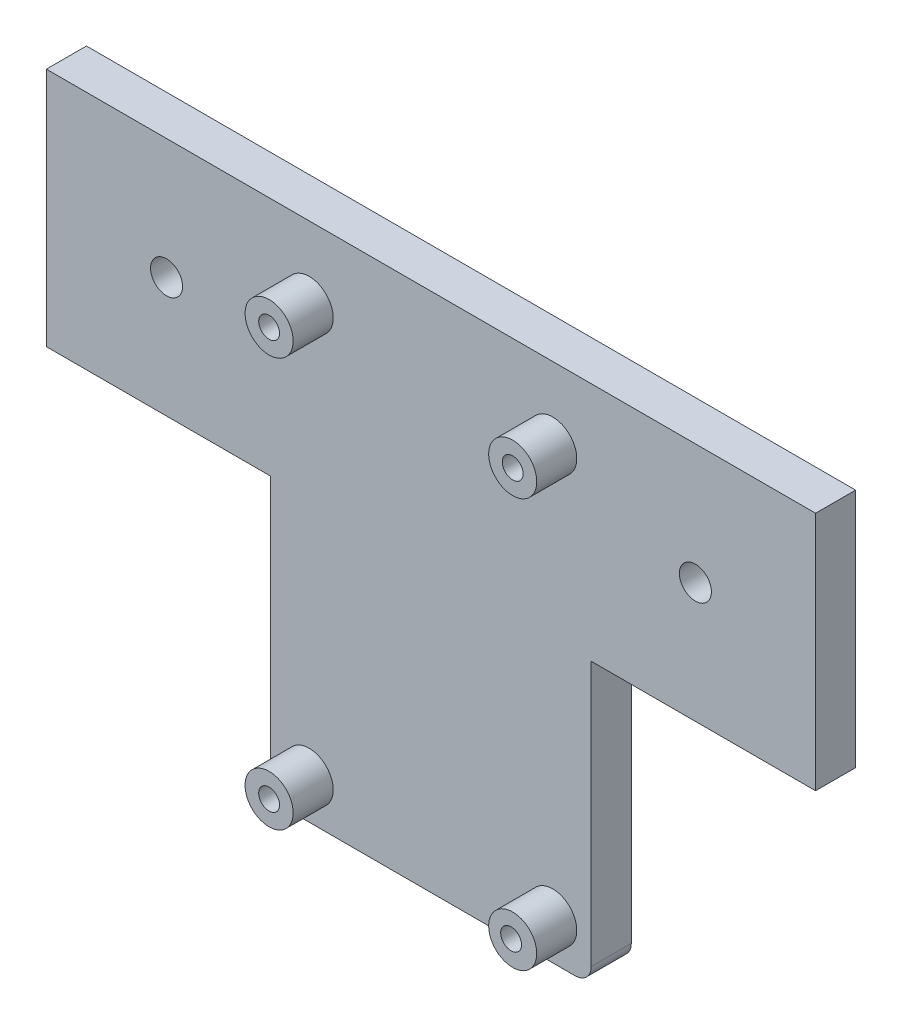
ISO-10303-21;
HEADER;
FILE_DESCRIPTION(('STEP AP214'),'2;1');
FILE_NAME('part.step','',(''),(''),'','','');
FILE_SCHEMA(('AUTOMOTIVE_DESIGN { 1 0 10303 214 1 1 1 1 }'));
ENDSEC;
DATA;
#1=APPLICATION_CONTEXT('core data for automotive mechanical design processes');
#2=APPLICATION_PROTOCOL_DEFINITION('international standard','automotive_design',2000,#1);
#3=PRODUCT_CONTEXT('',#1,'mechanical');
#4=PRODUCT('Part','Part','',(#3));
#5=PRODUCT_RELATED_PRODUCT_CATEGORY('part','',(#4));
#6=PRODUCT_DEFINITION_FORMATION('','',#4);
#7=PRODUCT_DEFINITION_CONTEXT('part definition',#1,'design');
#8=PRODUCT_DEFINITION('design','',#6,#7);
#9=PRODUCT_DEFINITION_SHAPE('','',#8);
#10=(LENGTH_UNIT() NAMED_UNIT(*) SI_UNIT(.MILLI.,.METRE.));
#11=(NAMED_UNIT(*) PLANE_ANGLE_UNIT() SI_UNIT($,.RADIAN.));
#12=(NAMED_UNIT(*) SI_UNIT($,.STERADIAN.) SOLID_ANGLE_UNIT());
#13=UNCERTAINTY_MEASURE_WITH_UNIT(LENGTH_MEASURE(1.E-05),#10,'distance_accuracy_value','');
#14=(GEOMETRIC_REPRESENTATION_CONTEXT(3) GLOBAL_UNCERTAINTY_ASSIGNED_CONTEXT((#13)) GLOBAL_UNIT_ASSIGNED_CONTEXT((#10,
#11,#12)) REPRESENTATION_CONTEXT('',''));
#15=CARTESIAN_POINT('',(0.,0.,0.));
#16=DIRECTION('',(0.,0.,1.));
#17=DIRECTION('',(1.,0.,0.));
#18=AXIS2_PLACEMENT_3D('',#15,#16,#17);
#19=CARTESIAN_POINT('',(0.,0.,5.));
#20=DIRECTION('',(0.,1.,0.));
#21=DIRECTION('',(0.,0.,1.));
#22=AXIS2_PLACEMENT_3D('',#19,#20,#21);
#23=PLANE('',#22);
#24=DIRECTION('',(0.,0.,1.));
#25=VECTOR('',#24,1.);
#26=CARTESIAN_POINT('',(68.,0.,0.));
#27=LINE('',#26,#25);
#28=CARTESIAN_POINT('',(68.,0.,0.));
#29=VERTEX_POINT('',#28);
#30=CARTESIAN_POINT('',(68.,0.,5.));
#31=VERTEX_POINT('',#30);
#32=EDGE_CURVE('E118',#29,#31,#27,.T.);
#33=ORIENTED_EDGE('',*,*,#32,.F.);
#34=DIRECTION('',(1.,0.,0.));
#35=VECTOR('',#34,1.);
#36=CARTESIAN_POINT('',(0.,0.,0.));
#37=LINE('',#36,#35);
#38=CARTESIAN_POINT('',(96.,0.,0.));
#39=VERTEX_POINT('',#38);
#40=EDGE_CURVE('E126',#29,#39,#37,.T.);
#41=ORIENTED_EDGE('',*,*,#40,.T.);
#42=DIRECTION('',(0.,0.,-1.));
#43=VECTOR('',#42,1.);
#44=CARTESIAN_POINT('',(96.,0.,5.));
#45=LINE('',#44,#43);
#46=CARTESIAN_POINT('',(96.,0.,5.));
#47=VERTEX_POINT('',#46);
#48=EDGE_CURVE('E162',#47,#39,#45,.T.);
#49=ORIENTED_EDGE('',*,*,#48,.F.);
#50=DIRECTION('',(1.,0.,0.));
#51=VECTOR('',#50,1.);
#52=CARTESIAN_POINT('',(0.,0.,5.));
#53=LINE('',#52,#51);
#54=EDGE_CURVE('E128',#31,#47,#53,.T.);
#55=ORIENTED_EDGE('',*,*,#54,.F.);
#56=EDGE_LOOP('',(#33,#41,#49,#55));
#57=FACE_BOUND('',#56,.T.);
#58=ADVANCED_FACE('F39',(#57),#23,.F.);
#59=CARTESIAN_POINT('',(0.,0.,5.));
#60=DIRECTION('',(1.,0.,0.));
#61=DIRECTION('',(0.,0.,-1.));
#62=AXIS2_PLACEMENT_3D('',#59,#60,#61);
#63=PLANE('',#62);
#64=DIRECTION('',(0.,-1.,0.));
#65=VECTOR('',#64,1.);
#66=CARTESIAN_POINT('',(0.,0.,0.));
#67=LINE('',#66,#65);
#68=CARTESIAN_POINT('',(0.,30.,0.));
#69=VERTEX_POINT('',#68);
#70=CARTESIAN_POINT('',(0.,0.,0.));
#71=VERTEX_POINT('',#70);
#72=EDGE_CURVE('E138',#69,#71,#67,.T.);
#73=ORIENTED_EDGE('',*,*,#72,.T.);
#74=DIRECTION('',(0.,0.,-1.));
#75=VECTOR('',#74,1.);
#76=CARTESIAN_POINT('',(0.,0.,5.));
#77=LINE('',#76,#75);
#78=CARTESIAN_POINT('',(0.,0.,5.));
#79=VERTEX_POINT('',#78);
#80=EDGE_CURVE('E165',#79,#71,#77,.T.);
#81=ORIENTED_EDGE('',*,*,#80,.F.);
#82=DIRECTION('',(0.,-1.,0.));
#83=VECTOR('',#82,1.);
#84=CARTESIAN_POINT('',(0.,0.,5.));
#85=LINE('',#84,#83);
#86=CARTESIAN_POINT('',(0.,30.,5.));
#87=VERTEX_POINT('',#86);
#88=EDGE_CURVE('E152',#87,#79,#85,.T.);
#89=ORIENTED_EDGE('',*,*,#88,.F.);
#90=DIRECTION('',(0.,0.,-1.));
#91=VECTOR('',#90,1.);
#92=CARTESIAN_POINT('',(0.,30.,5.));
#93=LINE('',#92,#91);
#94=EDGE_CURVE('E153',#87,#69,#93,.T.);
#95=ORIENTED_EDGE('',*,*,#94,.T.);
#96=EDGE_LOOP('',(#73,#81,#89,#95));
#97=FACE_BOUND('',#96,.T.);
#98=ADVANCED_FACE('F258',(#97),#63,.F.);
#99=CARTESIAN_POINT('',(28.,0.,0.));
#100=VERTEX_POINT('',#99);
#101=EDGE_CURVE('E137',#71,#100,#37,.T.);
#102=ORIENTED_EDGE('',*,*,#101,.T.);
#103=DIRECTION('',(0.,0.,1.));
#104=VECTOR('',#103,1.);
#105=CARTESIAN_POINT('',(28.,0.,0.));
#106=LINE('',#105,#104);
#107=CARTESIAN_POINT('',(28.,0.,5.));
#108=VERTEX_POINT('',#107);
#109=EDGE_CURVE('E130',#100,#108,#106,.T.);
#110=ORIENTED_EDGE('',*,*,#109,.T.);
#111=EDGE_CURVE('E242',#79,#108,#53,.T.);
#112=ORIENTED_EDGE('',*,*,#111,.F.);
#113=ORIENTED_EDGE('',*,*,#80,.T.);
#114=EDGE_LOOP('',(#102,#110,#112,#113));
#115=FACE_BOUND('',#114,.T.);
#116=ADVANCED_FACE('F260',(#115),#23,.F.);
#117=CARTESIAN_POINT('',(96.,0.,5.));
#118=DIRECTION('',(-1.,0.,0.));
#119=DIRECTION('',(0.,0.,1.));
#120=AXIS2_PLACEMENT_3D('',#117,#118,#119);
#121=PLANE('',#120);
#122=DIRECTION('',(0.,1.,0.));
#123=VECTOR('',#122,1.);
#124=CARTESIAN_POINT('',(96.,0.,0.));
#125=LINE('',#124,#123);
#126=CARTESIAN_POINT('',(96.,30.,0.));
#127=VERTEX_POINT('',#126);
#128=EDGE_CURVE('E135',#39,#127,#125,.T.);
#129=ORIENTED_EDGE('',*,*,#128,.T.);
#130=DIRECTION('',(0.,0.,-1.));
#131=VECTOR('',#130,1.);
#132=CARTESIAN_POINT('',(96.,30.,5.));
#133=LINE('',#132,#131);
#134=CARTESIAN_POINT('',(96.,30.,5.));
#135=VERTEX_POINT('',#134);
#136=EDGE_CURVE('E157',#135,#127,#133,.T.);
#137=ORIENTED_EDGE('',*,*,#136,.F.);
#138=DIRECTION('',(0.,1.,0.));
#139=VECTOR('',#138,1.);
#140=CARTESIAN_POINT('',(96.,0.,5.));
#141=LINE('',#140,#139);
#142=EDGE_CURVE('E245',#47,#135,#141,.T.);
#143=ORIENTED_EDGE('',*,*,#142,.F.);
#144=ORIENTED_EDGE('',*,*,#48,.T.);
#145=EDGE_LOOP('',(#129,#137,#143,#144));
#146=FACE_BOUND('',#145,.T.);
#147=ADVANCED_FACE('F262',(#146),#121,.F.);
#148=CARTESIAN_POINT('',(0.,30.,5.));
#149=DIRECTION('',(0.,-1.,0.));
#150=DIRECTION('',(0.,0.,-1.));
#151=AXIS2_PLACEMENT_3D('',#148,#149,#150);
#152=PLANE('',#151);
#153=DIRECTION('',(-1.,0.,0.));
#154=VECTOR('',#153,1.);
#155=CARTESIAN_POINT('',(0.,30.,0.));
#156=LINE('',#155,#154);
#157=EDGE_CURVE('E149',#127,#69,#156,.T.);
#158=ORIENTED_EDGE('',*,*,#157,.T.);
#159=ORIENTED_EDGE('',*,*,#94,.F.);
#160=DIRECTION('',(-1.,0.,0.));
#161=VECTOR('',#160,1.);
#162=CARTESIAN_POINT('',(0.,30.,5.));
#163=LINE('',#162,#161);
#164=EDGE_CURVE('E158',#135,#87,#163,.T.);
#165=ORIENTED_EDGE('',*,*,#164,.F.);
#166=ORIENTED_EDGE('',*,*,#136,.T.);
#167=EDGE_LOOP('',(#158,#159,#165,#166));
#168=FACE_BOUND('',#167,.T.);
#169=ADVANCED_FACE('F255',(#168),#152,.F.);
#170=CARTESIAN_POINT('',(0.,0.,5.));
#171=DIRECTION('',(0.,0.,-1.));
#172=DIRECTION('',(-1.,0.,0.));
#173=AXIS2_PLACEMENT_3D('',#170,#171,#172);
#174=PLANE('',#173);
#175=CARTESIAN_POINT('',(32.8,21.,5.));
#176=DIRECTION('',(0.,0.,-1.));
#177=DIRECTION('',(-1.,0.,0.));
#178=AXIS2_PLACEMENT_3D('',#175,#176,#177);
#179=CIRCLE('',#178,3.);
#180=CARTESIAN_POINT('',(29.8,21.,5.));
#181=VERTEX_POINT('',#180);
#182=EDGE_CURVE('E181',#181,#181,#179,.F.);
#183=ORIENTED_EDGE('',*,*,#182,.F.);
#184=EDGE_LOOP('',(#183));
#185=FACE_BOUND('',#184,.T.);
#186=CARTESIAN_POINT('',(63.2,21.,5.));
#187=DIRECTION('',(0.,0.,-1.));
#188=DIRECTION('',(-1.,0.,0.));
#189=AXIS2_PLACEMENT_3D('',#186,#187,#188);
#190=CIRCLE('',#189,3.00000000000001);
#191=CARTESIAN_POINT('',(60.2,21.,5.));
#192=VERTEX_POINT('',#191);
#193=EDGE_CURVE('E177',#192,#192,#190,.F.);
#194=ORIENTED_EDGE('',*,*,#193,.F.);
#195=EDGE_LOOP('',(#194));
#196=FACE_BOUND('',#195,.T.);
#197=CARTESIAN_POINT('',(63.2,-30.,5.));
#198=DIRECTION('',(0.,0.,-1.));
#199=DIRECTION('',(-1.,0.,0.));
#200=AXIS2_PLACEMENT_3D('',#197,#198,#199);
#201=CIRCLE('',#200,3.00000000000001);
#202=CARTESIAN_POINT('',(60.2,-30.,5.));
#203=VERTEX_POINT('',#202);
#204=EDGE_CURVE('E173',#203,#203,#201,.F.);
#205=ORIENTED_EDGE('',*,*,#204,.F.);
#206=EDGE_LOOP('',(#205));
#207=FACE_BOUND('',#206,.T.);
#208=CARTESIAN_POINT('',(32.8,-30.,5.));
#209=DIRECTION('',(0.,0.,-1.));
#210=DIRECTION('',(-1.,0.,0.));
#211=AXIS2_PLACEMENT_3D('',#208,#209,#210);
#212=CIRCLE('',#211,3.);
#213=CARTESIAN_POINT('',(29.8,-30.,5.));
#214=VERTEX_POINT('',#213);
#215=EDGE_CURVE('E169',#214,#214,#212,.F.);
#216=ORIENTED_EDGE('',*,*,#215,.F.);
#217=EDGE_LOOP('',(#216));
#218=FACE_BOUND('',#217,.T.);
#219=CARTESIAN_POINT('',(15.,15.,5.));
#220=DIRECTION('',(0.,0.,1.));
#221=DIRECTION('',(1.,0.,0.));
#222=AXIS2_PLACEMENT_3D('',#219,#220,#221);
#223=CIRCLE('',#222,2.);
#224=CARTESIAN_POINT('',(17.,15.,5.));
#225=VERTEX_POINT('',#224);
#226=EDGE_CURVE('E582',#225,#225,#223,.T.);
#227=ORIENTED_EDGE('',*,*,#226,.F.);
#228=EDGE_LOOP('',(#227));
#229=FACE_BOUND('',#228,.T.);
#230=CARTESIAN_POINT('',(81.,15.,5.));
#231=DIRECTION('',(0.,0.,1.));
#232=DIRECTION('',(1.,0.,0.));
#233=AXIS2_PLACEMENT_3D('',#230,#231,#232);
#234=CIRCLE('',#233,2.);
#235=CARTESIAN_POINT('',(83.,15.,5.));
#236=VERTEX_POINT('',#235);
#237=EDGE_CURVE('E578',#236,#236,#234,.T.);
#238=ORIENTED_EDGE('',*,*,#237,.F.);
#239=EDGE_LOOP('',(#238));
#240=FACE_BOUND('',#239,.T.);
#241=DIRECTION('',(0.,-1.,0.));
#242=VECTOR('',#241,1.);
#243=CARTESIAN_POINT('',(28.,0.,5.));
#244=LINE('',#243,#242);
#245=CARTESIAN_POINT('',(28.,-33.,5.));
#246=VERTEX_POINT('',#245);
#247=EDGE_CURVE('E225',#108,#246,#244,.T.);
#248=ORIENTED_EDGE('',*,*,#247,.T.);
#249=CARTESIAN_POINT('',(30.,-33.,5.));
#250=DIRECTION('',(0.,0.,-1.));
#251=DIRECTION('',(-1.,0.,0.));
#252=AXIS2_PLACEMENT_3D('',#249,#250,#251);
#253=CIRCLE('',#252,2.);
#254=CARTESIAN_POINT('',(30.,-35.,5.));
#255=VERTEX_POINT('',#254);
#256=EDGE_CURVE('E192',#246,#255,#253,.F.);
#257=ORIENTED_EDGE('',*,*,#256,.T.);
#258=DIRECTION('',(1.,0.,0.));
#259=VECTOR('',#258,1.);
#260=CARTESIAN_POINT('',(28.,-35.,5.));
#261=LINE('',#260,#259);
#262=CARTESIAN_POINT('',(66.,-35.,5.));
#263=VERTEX_POINT('',#262);
#264=EDGE_CURVE('E223',#255,#263,#261,.T.);
#265=ORIENTED_EDGE('',*,*,#264,.T.);
#266=CARTESIAN_POINT('',(66.,-33.,5.));
#267=DIRECTION('',(0.,0.,-1.));
#268=DIRECTION('',(-1.,0.,0.));
#269=AXIS2_PLACEMENT_3D('',#266,#267,#268);
#270=CIRCLE('',#269,2.);
#271=CARTESIAN_POINT('',(68.,-33.,5.));
#272=VERTEX_POINT('',#271);
#273=EDGE_CURVE('E189',#263,#272,#270,.F.);
#274=ORIENTED_EDGE('',*,*,#273,.T.);
#275=DIRECTION('',(0.,1.,0.));
#276=VECTOR('',#275,1.);
#277=CARTESIAN_POINT('',(68.,0.,5.));
#278=LINE('',#277,#276);
#279=EDGE_CURVE('E216',#272,#31,#278,.T.);
#280=ORIENTED_EDGE('',*,*,#279,.T.);
#281=ORIENTED_EDGE('',*,*,#54,.T.);
#282=ORIENTED_EDGE('',*,*,#142,.T.);
#283=ORIENTED_EDGE('',*,*,#164,.T.);
#284=ORIENTED_EDGE('',*,*,#88,.T.);
#285=ORIENTED_EDGE('',*,*,#111,.T.);
#286=EDGE_LOOP('',(#248,#257,#265,#274,#280,#281,#282,#283,#284,#285));
#287=FACE_BOUND('',#286,.T.);
#288=ADVANCED_FACE('F222',(#185,#196,#207,#218,#229,#240,#287),#174,.F.);
#289=CARTESIAN_POINT('',(0.,0.,0.));
#290=DIRECTION('',(0.,0.,-1.));
#291=DIRECTION('',(-1.,0.,0.));
#292=AXIS2_PLACEMENT_3D('',#289,#290,#291);
#293=PLANE('',#292);
#294=CARTESIAN_POINT('',(15.,15.,0.));
#295=DIRECTION('',(0.,0.,1.));
#296=DIRECTION('',(1.,0.,0.));
#297=AXIS2_PLACEMENT_3D('',#294,#295,#296);
#298=CIRCLE('',#297,2.);
#299=CARTESIAN_POINT('',(17.,15.,0.));
#300=VERTEX_POINT('',#299);
#301=EDGE_CURVE('E234',#300,#300,#298,.T.);
#302=ORIENTED_EDGE('',*,*,#301,.T.);
#303=EDGE_LOOP('',(#302));
#304=FACE_BOUND('',#303,.T.);
#305=CARTESIAN_POINT('',(81.,15.,0.));
#306=DIRECTION('',(0.,0.,1.));
#307=DIRECTION('',(1.,0.,0.));
#308=AXIS2_PLACEMENT_3D('',#305,#306,#307);
#309=CIRCLE('',#308,2.);
#310=CARTESIAN_POINT('',(83.,15.,0.));
#311=VERTEX_POINT('',#310);
#312=EDGE_CURVE('E586',#311,#311,#309,.T.);
#313=ORIENTED_EDGE('',*,*,#312,.T.);
#314=EDGE_LOOP('',(#313));
#315=FACE_BOUND('',#314,.T.);
#316=DIRECTION('',(1.,0.,0.));
#317=VECTOR('',#316,1.);
#318=CARTESIAN_POINT('',(28.,-35.,0.));
#319=LINE('',#318,#317);
#320=CARTESIAN_POINT('',(30.,-35.,0.));
#321=VERTEX_POINT('',#320);
#322=CARTESIAN_POINT('',(66.,-35.,0.));
#323=VERTEX_POINT('',#322);
#324=EDGE_CURVE('E122',#321,#323,#319,.T.);
#325=ORIENTED_EDGE('',*,*,#324,.F.);
#326=CARTESIAN_POINT('',(30.,-33.,0.));
#327=DIRECTION('',(0.,0.,-1.));
#328=DIRECTION('',(-1.,0.,0.));
#329=AXIS2_PLACEMENT_3D('',#326,#327,#328);
#330=CIRCLE('',#329,2.);
#331=CARTESIAN_POINT('',(28.,-33.,0.));
#332=VERTEX_POINT('',#331);
#333=EDGE_CURVE('E48',#321,#332,#330,.T.);
#334=ORIENTED_EDGE('',*,*,#333,.T.);
#335=DIRECTION('',(0.,-1.,0.));
#336=VECTOR('',#335,1.);
#337=CARTESIAN_POINT('',(28.,0.,0.));
#338=LINE('',#337,#336);
#339=EDGE_CURVE('E207',#100,#332,#338,.T.);
#340=ORIENTED_EDGE('',*,*,#339,.F.);
#341=ORIENTED_EDGE('',*,*,#101,.F.);
#342=ORIENTED_EDGE('',*,*,#72,.F.);
#343=ORIENTED_EDGE('',*,*,#157,.F.);
#344=ORIENTED_EDGE('',*,*,#128,.F.);
#345=ORIENTED_EDGE('',*,*,#40,.F.);
#346=DIRECTION('',(0.,1.,0.));
#347=VECTOR('',#346,1.);
#348=CARTESIAN_POINT('',(68.,0.,0.));
#349=LINE('',#348,#347);
#350=CARTESIAN_POINT('',(68.,-33.,0.));
#351=VERTEX_POINT('',#350);
#352=EDGE_CURVE('E115',#351,#29,#349,.T.);
#353=ORIENTED_EDGE('',*,*,#352,.F.);
#354=CARTESIAN_POINT('',(66.,-33.,0.));
#355=DIRECTION('',(0.,0.,-1.));
#356=DIRECTION('',(-1.,0.,0.));
#357=AXIS2_PLACEMENT_3D('',#354,#355,#356);
#358=CIRCLE('',#357,2.);
#359=EDGE_CURVE('E60',#351,#323,#358,.T.);
#360=ORIENTED_EDGE('',*,*,#359,.T.);
#361=EDGE_LOOP('',(#325,#334,#340,#341,#342,#343,#344,#345,#353,#360));
#362=FACE_BOUND('',#361,.T.);
#363=ADVANCED_FACE('F133',(#304,#315,#362),#293,.T.);
#364=CARTESIAN_POINT('',(28.,0.,0.));
#365=DIRECTION('',(-1.,0.,0.));
#366=DIRECTION('',(0.,-1.,0.));
#367=AXIS2_PLACEMENT_3D('',#364,#365,#366);
#368=PLANE('',#367);
#369=ORIENTED_EDGE('',*,*,#339,.T.);
#370=DIRECTION('',(0.,0.,1.));
#371=VECTOR('',#370,1.);
#372=CARTESIAN_POINT('',(28.,-33.,0.));
#373=LINE('',#372,#371);
#374=EDGE_CURVE('E185',#332,#246,#373,.T.);
#375=ORIENTED_EDGE('',*,*,#374,.T.);
#376=ORIENTED_EDGE('',*,*,#247,.F.);
#377=ORIENTED_EDGE('',*,*,#109,.F.);
#378=EDGE_LOOP('',(#369,#375,#376,#377));
#379=FACE_BOUND('',#378,.T.);
#380=ADVANCED_FACE('F212',(#379),#368,.T.);
#381=CARTESIAN_POINT('',(68.,0.,0.));
#382=DIRECTION('',(1.,0.,0.));
#383=DIRECTION('',(0.,0.,-1.));
#384=AXIS2_PLACEMENT_3D('',#381,#382,#383);
#385=PLANE('',#384);
#386=ORIENTED_EDGE('',*,*,#279,.F.);
#387=DIRECTION('',(0.,0.,1.));
#388=VECTOR('',#387,1.);
#389=CARTESIAN_POINT('',(68.,-33.,0.));
#390=LINE('',#389,#388);
#391=EDGE_CURVE('E11',#272,#351,#390,.F.);
#392=ORIENTED_EDGE('',*,*,#391,.T.);
#393=ORIENTED_EDGE('',*,*,#352,.T.);
#394=ORIENTED_EDGE('',*,*,#32,.T.);
#395=EDGE_LOOP('',(#386,#392,#393,#394));
#396=FACE_BOUND('',#395,.T.);
#397=ADVANCED_FACE('F117',(#396),#385,.T.);
#398=CARTESIAN_POINT('',(28.,-35.,0.));
#399=DIRECTION('',(0.,-1.,0.));
#400=DIRECTION('',(0.,0.,-1.));
#401=AXIS2_PLACEMENT_3D('',#398,#399,#400);
#402=PLANE('',#401);
#403=ORIENTED_EDGE('',*,*,#264,.F.);
#404=DIRECTION('',(0.,0.,1.));
#405=VECTOR('',#404,1.);
#406=CARTESIAN_POINT('',(30.,-35.,0.));
#407=LINE('',#406,#405);
#408=EDGE_CURVE('E199',#255,#321,#407,.F.);
#409=ORIENTED_EDGE('',*,*,#408,.T.);
#410=ORIENTED_EDGE('',*,*,#324,.T.);
#411=DIRECTION('',(0.,0.,1.));
#412=VECTOR('',#411,1.);
#413=CARTESIAN_POINT('',(66.,-35.,0.));
#414=LINE('',#413,#412);
#415=EDGE_CURVE('E195',#323,#263,#414,.T.);
#416=ORIENTED_EDGE('',*,*,#415,.T.);
#417=EDGE_LOOP('',(#403,#409,#410,#416));
#418=FACE_BOUND('',#417,.T.);
#419=ADVANCED_FACE('F227',(#418),#402,.T.);
#420=CARTESIAN_POINT('',(81.,15.,0.));
#421=DIRECTION('',(0.,0.,1.));
#422=DIRECTION('',(1.,0.,0.));
#423=AXIS2_PLACEMENT_3D('',#420,#421,#422);
#424=CYLINDRICAL_SURFACE('',#423,2.);
#425=ORIENTED_EDGE('',*,*,#312,.F.);
#426=EDGE_LOOP('',(#425));
#427=FACE_BOUND('',#426,.T.);
#428=ORIENTED_EDGE('',*,*,#237,.T.);
#429=EDGE_LOOP('',(#428));
#430=FACE_BOUND('',#429,.T.);
#431=ADVANCED_FACE('F339',(#427,#430),#424,.F.);
#432=CARTESIAN_POINT('',(15.,15.,0.));
#433=DIRECTION('',(0.,0.,1.));
#434=DIRECTION('',(1.,0.,0.));
#435=AXIS2_PLACEMENT_3D('',#432,#433,#434);
#436=CYLINDRICAL_SURFACE('',#435,2.);
#437=ORIENTED_EDGE('',*,*,#301,.F.);
#438=EDGE_LOOP('',(#437));
#439=FACE_BOUND('',#438,.T.);
#440=ORIENTED_EDGE('',*,*,#226,.T.);
#441=EDGE_LOOP('',(#440));
#442=FACE_BOUND('',#441,.T.);
#443=ADVANCED_FACE('F349',(#439,#442),#436,.F.);
#444=CARTESIAN_POINT('',(32.8,-30.,10.));
#445=DIRECTION('',(0.,0.,-1.));
#446=DIRECTION('',(-1.,0.,0.));
#447=AXIS2_PLACEMENT_3D('',#444,#445,#446);
#448=CYLINDRICAL_SURFACE('',#447,3.);
#449=CARTESIAN_POINT('',(32.8,-30.,10.));
#450=DIRECTION('',(0.,0.,1.));
#451=DIRECTION('',(1.,0.,0.));
#452=AXIS2_PLACEMENT_3D('',#449,#450,#451);
#453=CIRCLE('',#452,3.);
#454=CARTESIAN_POINT('',(35.8,-30.,10.));
#455=VERTEX_POINT('',#454);
#456=EDGE_CURVE('E574',#455,#455,#453,.T.);
#457=ORIENTED_EDGE('',*,*,#456,.F.);
#458=EDGE_LOOP('',(#457));
#459=FACE_BOUND('',#458,.T.);
#460=ORIENTED_EDGE('',*,*,#215,.T.);
#461=EDGE_LOOP('',(#460));
#462=FACE_BOUND('',#461,.T.);
#463=ADVANCED_FACE('F356',(#459,#462),#448,.T.);
#464=CARTESIAN_POINT('',(32.8,-30.,10.));
#465=DIRECTION('',(0.,0.,1.));
#466=DIRECTION('',(1.,0.,0.));
#467=AXIS2_PLACEMENT_3D('',#464,#465,#466);
#468=PLANE('',#467);
#469=CARTESIAN_POINT('',(32.8,-30.,10.));
#470=DIRECTION('',(0.,0.,1.));
#471=DIRECTION('',(1.,0.,0.));
#472=AXIS2_PLACEMENT_3D('',#469,#470,#471);
#473=CIRCLE('',#472,1.3);
#474=CARTESIAN_POINT('',(34.1,-30.,10.));
#475=VERTEX_POINT('',#474);
#476=EDGE_CURVE('E542',#475,#475,#473,.T.);
#477=ORIENTED_EDGE('',*,*,#476,.F.);
#478=EDGE_LOOP('',(#477));
#479=FACE_BOUND('',#478,.T.);
#480=ORIENTED_EDGE('',*,*,#456,.T.);
#481=EDGE_LOOP('',(#480));
#482=FACE_BOUND('',#481,.T.);
#483=ADVANCED_FACE('F364',(#479,#482),#468,.T.);
#484=CARTESIAN_POINT('',(63.2,-30.,10.));
#485=DIRECTION('',(0.,0.,-1.));
#486=DIRECTION('',(-1.,0.,0.));
#487=AXIS2_PLACEMENT_3D('',#484,#485,#486);
#488=CYLINDRICAL_SURFACE('',#487,3.00000000000001);
#489=CARTESIAN_POINT('',(63.2,-30.,10.));
#490=DIRECTION('',(0.,0.,1.));
#491=DIRECTION('',(1.,0.,0.));
#492=AXIS2_PLACEMENT_3D('',#489,#490,#491);
#493=CIRCLE('',#492,3.00000000000001);
#494=CARTESIAN_POINT('',(66.2,-30.,10.));
#495=VERTEX_POINT('',#494);
#496=EDGE_CURVE('E570',#495,#495,#493,.T.);
#497=ORIENTED_EDGE('',*,*,#496,.F.);
#498=EDGE_LOOP('',(#497));
#499=FACE_BOUND('',#498,.T.);
#500=ORIENTED_EDGE('',*,*,#204,.T.);
#501=EDGE_LOOP('',(#500));
#502=FACE_BOUND('',#501,.T.);
#503=ADVANCED_FACE('F373',(#499,#502),#488,.T.);
#504=CARTESIAN_POINT('',(63.2,-30.,10.));
#505=DIRECTION('',(0.,0.,1.));
#506=DIRECTION('',(1.,0.,0.));
#507=AXIS2_PLACEMENT_3D('',#504,#505,#506);
#508=PLANE('',#507);
#509=CARTESIAN_POINT('',(63.,-30.,10.));
#510=DIRECTION('',(0.,0.,1.));
#511=DIRECTION('',(1.,0.,0.));
#512=AXIS2_PLACEMENT_3D('',#509,#510,#511);
#513=CIRCLE('',#512,1.29999999999999);
#514=CARTESIAN_POINT('',(64.3,-30.,10.));
#515=VERTEX_POINT('',#514);
#516=EDGE_CURVE('E601',#515,#515,#513,.T.);
#517=ORIENTED_EDGE('',*,*,#516,.F.);
#518=EDGE_LOOP('',(#517));
#519=FACE_BOUND('',#518,.T.);
#520=ORIENTED_EDGE('',*,*,#496,.T.);
#521=EDGE_LOOP('',(#520));
#522=FACE_BOUND('',#521,.T.);
#523=ADVANCED_FACE('F382',(#519,#522),#508,.T.);
#524=CARTESIAN_POINT('',(63.2,21.,10.));
#525=DIRECTION('',(0.,0.,-1.));
#526=DIRECTION('',(-1.,0.,0.));
#527=AXIS2_PLACEMENT_3D('',#524,#525,#526);
#528=CYLINDRICAL_SURFACE('',#527,3.00000000000001);
#529=CARTESIAN_POINT('',(63.2,21.,10.));
#530=DIRECTION('',(0.,0.,1.));
#531=DIRECTION('',(1.,0.,0.));
#532=AXIS2_PLACEMENT_3D('',#529,#530,#531);
#533=CIRCLE('',#532,3.00000000000001);
#534=CARTESIAN_POINT('',(66.2,21.,10.));
#535=VERTEX_POINT('',#534);
#536=EDGE_CURVE('E566',#535,#535,#533,.T.);
#537=ORIENTED_EDGE('',*,*,#536,.F.);
#538=EDGE_LOOP('',(#537));
#539=FACE_BOUND('',#538,.T.);
#540=ORIENTED_EDGE('',*,*,#193,.T.);
#541=EDGE_LOOP('',(#540));
#542=FACE_BOUND('',#541,.T.);
#543=ADVANCED_FACE('F390',(#539,#542),#528,.T.);
#544=CARTESIAN_POINT('',(63.2,21.,10.));
#545=DIRECTION('',(0.,0.,1.));
#546=DIRECTION('',(1.,0.,0.));
#547=AXIS2_PLACEMENT_3D('',#544,#545,#546);
#548=PLANE('',#547);
#549=CARTESIAN_POINT('',(63.2,21.,10.));
#550=DIRECTION('',(0.,0.,1.));
#551=DIRECTION('',(1.,0.,0.));
#552=AXIS2_PLACEMENT_3D('',#549,#550,#551);
#553=CIRCLE('',#552,1.29999999999999);
#554=CARTESIAN_POINT('',(64.5,21.,10.));
#555=VERTEX_POINT('',#554);
#556=EDGE_CURVE('E541',#555,#555,#553,.T.);
#557=ORIENTED_EDGE('',*,*,#556,.F.);
#558=EDGE_LOOP('',(#557));
#559=FACE_BOUND('',#558,.T.);
#560=ORIENTED_EDGE('',*,*,#536,.T.);
#561=EDGE_LOOP('',(#560));
#562=FACE_BOUND('',#561,.T.);
#563=ADVANCED_FACE('F398',(#559,#562),#548,.T.);
#564=CARTESIAN_POINT('',(32.8,21.,10.));
#565=DIRECTION('',(0.,0.,-1.));
#566=DIRECTION('',(-1.,0.,0.));
#567=AXIS2_PLACEMENT_3D('',#564,#565,#566);
#568=CYLINDRICAL_SURFACE('',#567,3.);
#569=CARTESIAN_POINT('',(32.8,21.,10.));
#570=DIRECTION('',(0.,0.,1.));
#571=DIRECTION('',(1.,0.,0.));
#572=AXIS2_PLACEMENT_3D('',#569,#570,#571);
#573=CIRCLE('',#572,3.);
#574=CARTESIAN_POINT('',(35.8,21.,10.));
#575=VERTEX_POINT('',#574);
#576=EDGE_CURVE('E558',#575,#575,#573,.T.);
#577=ORIENTED_EDGE('',*,*,#576,.F.);
#578=EDGE_LOOP('',(#577));
#579=FACE_BOUND('',#578,.T.);
#580=ORIENTED_EDGE('',*,*,#182,.T.);
#581=EDGE_LOOP('',(#580));
#582=FACE_BOUND('',#581,.T.);
#583=ADVANCED_FACE('F405',(#579,#582),#568,.T.);
#584=CARTESIAN_POINT('',(32.8,21.,10.));
#585=DIRECTION('',(0.,0.,1.));
#586=DIRECTION('',(1.,0.,0.));
#587=AXIS2_PLACEMENT_3D('',#584,#585,#586);
#588=PLANE('',#587);
#589=CARTESIAN_POINT('',(32.8,21.,10.));
#590=DIRECTION('',(0.,0.,1.));
#591=DIRECTION('',(1.,0.,0.));
#592=AXIS2_PLACEMENT_3D('',#589,#590,#591);
#593=CIRCLE('',#592,1.3);
#594=CARTESIAN_POINT('',(34.1,21.,10.));
#595=VERTEX_POINT('',#594);
#596=EDGE_CURVE('E559',#595,#595,#593,.T.);
#597=ORIENTED_EDGE('',*,*,#596,.F.);
#598=EDGE_LOOP('',(#597));
#599=FACE_BOUND('',#598,.T.);
#600=ORIENTED_EDGE('',*,*,#576,.T.);
#601=EDGE_LOOP('',(#600));
#602=FACE_BOUND('',#601,.T.);
#603=ADVANCED_FACE('F413',(#599,#602),#588,.T.);
#604=CARTESIAN_POINT('',(32.8,21.,3.));
#605=DIRECTION('',(0.,0.,1.));
#606=DIRECTION('',(1.,0.,0.));
#607=AXIS2_PLACEMENT_3D('',#604,#605,#606);
#608=CYLINDRICAL_SURFACE('',#607,1.3);
#609=CARTESIAN_POINT('',(32.8,21.,3.));
#610=DIRECTION('',(0.,0.,1.));
#611=DIRECTION('',(1.,0.,0.));
#612=AXIS2_PLACEMENT_3D('',#609,#610,#611);
#613=CIRCLE('',#612,1.3);
#614=CARTESIAN_POINT('',(34.1,21.,3.));
#615=VERTEX_POINT('',#614);
#616=EDGE_CURVE('E554',#615,#615,#613,.T.);
#617=ORIENTED_EDGE('',*,*,#616,.F.);
#618=EDGE_LOOP('',(#617));
#619=FACE_BOUND('',#618,.T.);
#620=ORIENTED_EDGE('',*,*,#596,.T.);
#621=EDGE_LOOP('',(#620));
#622=FACE_BOUND('',#621,.T.);
#623=ADVANCED_FACE('F420',(#619,#622),#608,.F.);
#624=CARTESIAN_POINT('',(32.8,21.,3.));
#625=DIRECTION('',(0.,0.,1.));
#626=DIRECTION('',(1.,0.,0.));
#627=AXIS2_PLACEMENT_3D('',#624,#625,#626);
#628=PLANE('',#627);
#629=ORIENTED_EDGE('',*,*,#616,.T.);
#630=EDGE_LOOP('',(#629));
#631=FACE_BOUND('',#630,.T.);
#632=ADVANCED_FACE('F428',(#631),#628,.T.);
#633=CARTESIAN_POINT('',(63.2,21.,3.));
#634=DIRECTION('',(0.,0.,1.));
#635=DIRECTION('',(1.,0.,0.));
#636=AXIS2_PLACEMENT_3D('',#633,#634,#635);
#637=CYLINDRICAL_SURFACE('',#636,1.29999999999999);
#638=CARTESIAN_POINT('',(63.2,21.,3.));
#639=DIRECTION('',(0.,0.,1.));
#640=DIRECTION('',(1.,0.,0.));
#641=AXIS2_PLACEMENT_3D('',#638,#639,#640);
#642=CIRCLE('',#641,1.29999999999999);
#643=CARTESIAN_POINT('',(64.5,21.,3.));
#644=VERTEX_POINT('',#643);
#645=EDGE_CURVE('E547',#644,#644,#642,.T.);
#646=ORIENTED_EDGE('',*,*,#645,.F.);
#647=EDGE_LOOP('',(#646));
#648=FACE_BOUND('',#647,.T.);
#649=ORIENTED_EDGE('',*,*,#556,.T.);
#650=EDGE_LOOP('',(#649));
#651=FACE_BOUND('',#650,.T.);
#652=ADVANCED_FACE('F436',(#648,#651),#637,.F.);
#653=CARTESIAN_POINT('',(63.2,21.,3.));
#654=DIRECTION('',(0.,0.,1.));
#655=DIRECTION('',(1.,0.,0.));
#656=AXIS2_PLACEMENT_3D('',#653,#654,#655);
#657=PLANE('',#656);
#658=ORIENTED_EDGE('',*,*,#645,.T.);
#659=EDGE_LOOP('',(#658));
#660=FACE_BOUND('',#659,.T.);
#661=ADVANCED_FACE('F444',(#660),#657,.T.);
#662=CARTESIAN_POINT('',(63.,-30.,3.));
#663=DIRECTION('',(0.,0.,1.));
#664=DIRECTION('',(1.,0.,0.));
#665=AXIS2_PLACEMENT_3D('',#662,#663,#664);
#666=CYLINDRICAL_SURFACE('',#665,1.29999999999999);
#667=CARTESIAN_POINT('',(63.,-30.,3.));
#668=DIRECTION('',(0.,0.,1.));
#669=DIRECTION('',(1.,0.,0.));
#670=AXIS2_PLACEMENT_3D('',#667,#668,#669);
#671=CIRCLE('',#670,1.29999999999999);
#672=CARTESIAN_POINT('',(64.3,-30.,3.));
#673=VERTEX_POINT('',#672);
#674=EDGE_CURVE('E550',#673,#673,#671,.T.);
#675=ORIENTED_EDGE('',*,*,#674,.F.);
#676=EDGE_LOOP('',(#675));
#677=FACE_BOUND('',#676,.T.);
#678=ORIENTED_EDGE('',*,*,#516,.T.);
#679=EDGE_LOOP('',(#678));
#680=FACE_BOUND('',#679,.T.);
#681=ADVANCED_FACE('F452',(#677,#680),#666,.F.);
#682=CARTESIAN_POINT('',(63.,-30.,3.));
#683=DIRECTION('',(0.,0.,1.));
#684=DIRECTION('',(1.,0.,0.));
#685=AXIS2_PLACEMENT_3D('',#682,#683,#684);
#686=PLANE('',#685);
#687=ORIENTED_EDGE('',*,*,#674,.T.);
#688=EDGE_LOOP('',(#687));
#689=FACE_BOUND('',#688,.T.);
#690=ADVANCED_FACE('F460',(#689),#686,.T.);
#691=CARTESIAN_POINT('',(32.8,-30.,3.));
#692=DIRECTION('',(0.,0.,1.));
#693=DIRECTION('',(1.,0.,0.));
#694=AXIS2_PLACEMENT_3D('',#691,#692,#693);
#695=CYLINDRICAL_SURFACE('',#694,1.3);
#696=CARTESIAN_POINT('',(32.8,-30.,3.));
#697=DIRECTION('',(0.,0.,1.));
#698=DIRECTION('',(1.,0.,0.));
#699=AXIS2_PLACEMENT_3D('',#696,#697,#698);
#700=CIRCLE('',#699,1.3);
#701=CARTESIAN_POINT('',(34.1,-30.,3.));
#702=VERTEX_POINT('',#701);
#703=EDGE_CURVE('E539',#702,#702,#700,.T.);
#704=ORIENTED_EDGE('',*,*,#703,.F.);
#705=EDGE_LOOP('',(#704));
#706=FACE_BOUND('',#705,.T.);
#707=ORIENTED_EDGE('',*,*,#476,.T.);
#708=EDGE_LOOP('',(#707));
#709=FACE_BOUND('',#708,.T.);
#710=ADVANCED_FACE('F468',(#706,#709),#695,.F.);
#711=CARTESIAN_POINT('',(32.8,-30.,3.));
#712=DIRECTION('',(0.,0.,1.));
#713=DIRECTION('',(1.,0.,0.));
#714=AXIS2_PLACEMENT_3D('',#711,#712,#713);
#715=PLANE('',#714);
#716=ORIENTED_EDGE('',*,*,#703,.T.);
#717=EDGE_LOOP('',(#716));
#718=FACE_BOUND('',#717,.T.);
#719=ADVANCED_FACE('F476',(#718),#715,.T.);
#720=CARTESIAN_POINT('',(30.,-33.,0.));
#721=DIRECTION('',(0.,0.,1.));
#722=DIRECTION('',(1.,0.,0.));
#723=AXIS2_PLACEMENT_3D('',#720,#721,#722);
#724=CYLINDRICAL_SURFACE('',#723,2.);
#725=ORIENTED_EDGE('',*,*,#333,.F.);
#726=ORIENTED_EDGE('',*,*,#408,.F.);
#727=ORIENTED_EDGE('',*,*,#256,.F.);
#728=ORIENTED_EDGE('',*,*,#374,.F.);
#729=EDGE_LOOP('',(#725,#726,#727,#728));
#730=FACE_BOUND('',#729,.T.);
#731=ADVANCED_FACE('F218',(#730),#724,.T.);
#732=CARTESIAN_POINT('',(66.,-33.,0.));
#733=DIRECTION('',(0.,0.,1.));
#734=DIRECTION('',(1.,0.,0.));
#735=AXIS2_PLACEMENT_3D('',#732,#733,#734);
#736=CYLINDRICAL_SURFACE('',#735,2.);
#737=ORIENTED_EDGE('',*,*,#359,.F.);
#738=ORIENTED_EDGE('',*,*,#391,.F.);
#739=ORIENTED_EDGE('',*,*,#273,.F.);
#740=ORIENTED_EDGE('',*,*,#415,.F.);
#741=EDGE_LOOP('',(#737,#738,#739,#740));
#742=FACE_BOUND('',#741,.T.);
#743=ADVANCED_FACE('F41',(#742),#736,.T.);
#744=CLOSED_SHELL('',(#58,#98,#116,#147,#169,#288,#363,#380,#397,#419,#431,#443,#463,#483,#503,
#523,#543,#563,#583,#603,#623,#632,#652,#661,#681,#690,#710,#719,#731,#743));
#745=MANIFOLD_SOLID_BREP('B2',#744);
#746=ADVANCED_BREP_SHAPE_REPRESENTATION('',(#18,#745),#14);
#747=SHAPE_DEFINITION_REPRESENTATION(#9,#746);
ENDSEC;
END-ISO-10303-21;
